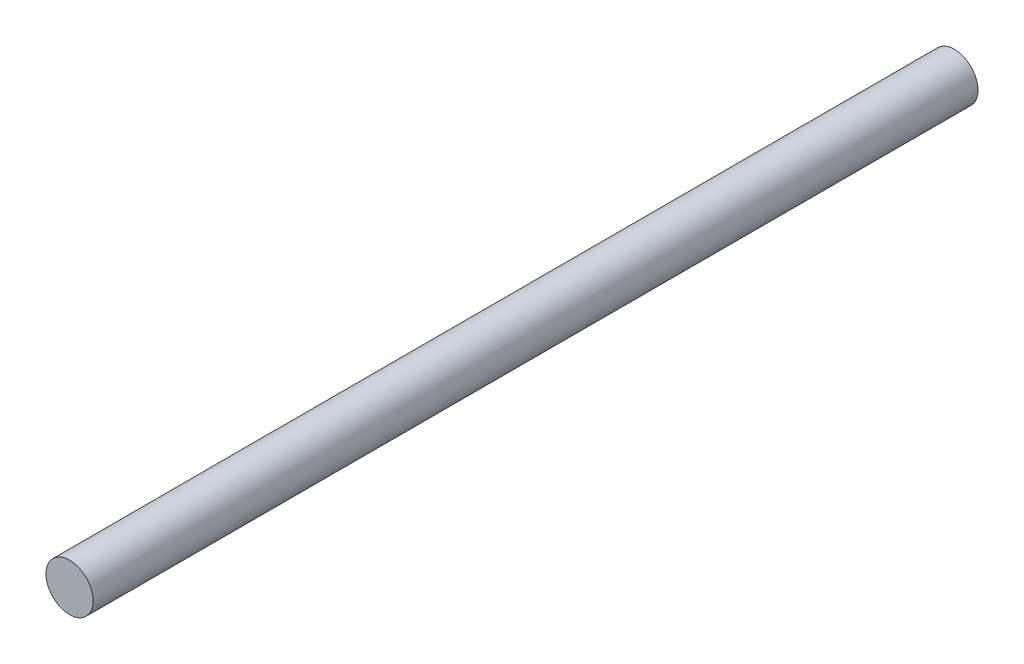
ISO-10303-21;
HEADER;
FILE_DESCRIPTION(('STEP AP214'),'2;1');
FILE_NAME('part.step','',(''),(''),'','','');
FILE_SCHEMA(('AUTOMOTIVE_DESIGN { 1 0 10303 214 1 1 1 1 }'));
ENDSEC;
DATA;
#1=APPLICATION_CONTEXT('core data for automotive mechanical design processes');
#2=APPLICATION_PROTOCOL_DEFINITION('international standard','automotive_design',2000,#1);
#3=PRODUCT_CONTEXT('',#1,'mechanical');
#4=PRODUCT('Part','Part','',(#3));
#5=PRODUCT_RELATED_PRODUCT_CATEGORY('part','',(#4));
#6=PRODUCT_DEFINITION_FORMATION('','',#4);
#7=PRODUCT_DEFINITION_CONTEXT('part definition',#1,'design');
#8=PRODUCT_DEFINITION('design','',#6,#7);
#9=PRODUCT_DEFINITION_SHAPE('','',#8);
#10=(LENGTH_UNIT() NAMED_UNIT(*) SI_UNIT(.MILLI.,.METRE.));
#11=(NAMED_UNIT(*) PLANE_ANGLE_UNIT() SI_UNIT($,.RADIAN.));
#12=(NAMED_UNIT(*) SI_UNIT($,.STERADIAN.) SOLID_ANGLE_UNIT());
#13=UNCERTAINTY_MEASURE_WITH_UNIT(LENGTH_MEASURE(1.E-05),#10,'distance_accuracy_value','');
#14=(GEOMETRIC_REPRESENTATION_CONTEXT(3) GLOBAL_UNCERTAINTY_ASSIGNED_CONTEXT((#13)) GLOBAL_UNIT_ASSIGNED_CONTEXT((#10,
#11,#12)) REPRESENTATION_CONTEXT('',''));
#15=CARTESIAN_POINT('',(0.,0.,0.));
#16=DIRECTION('',(0.,0.,1.));
#17=DIRECTION('',(1.,0.,0.));
#18=AXIS2_PLACEMENT_3D('',#15,#16,#17);
#19=CARTESIAN_POINT('',(0.,0.,300.));
#20=DIRECTION('',(0.,0.,-1.));
#21=DIRECTION('',(-1.,0.,0.));
#22=AXIS2_PLACEMENT_3D('',#19,#20,#21);
#23=CYLINDRICAL_SURFACE('',#22,8.);
#24=CARTESIAN_POINT('',(0.,0.,300.));
#25=DIRECTION('',(0.,0.,1.));
#26=DIRECTION('',(1.,0.,0.));
#27=AXIS2_PLACEMENT_3D('',#24,#25,#26);
#28=CIRCLE('',#27,8.);
#29=CARTESIAN_POINT('',(8.,0.,300.));
#30=VERTEX_POINT('',#29);
#31=EDGE_CURVE('E10',#30,#30,#28,.T.);
#32=ORIENTED_EDGE('',*,*,#31,.F.);
#33=EDGE_LOOP('',(#32));
#34=FACE_BOUND('',#33,.T.);
#35=CARTESIAN_POINT('',(0.,0.,0.));
#36=DIRECTION('',(0.,0.,1.));
#37=DIRECTION('',(1.,0.,0.));
#38=AXIS2_PLACEMENT_3D('',#35,#36,#37);
#39=CIRCLE('',#38,8.);
#40=CARTESIAN_POINT('',(8.,0.,0.));
#41=VERTEX_POINT('',#40);
#42=EDGE_CURVE('E40',#41,#41,#39,.T.);
#43=ORIENTED_EDGE('',*,*,#42,.T.);
#44=EDGE_LOOP('',(#43));
#45=FACE_BOUND('',#44,.T.);
#46=ADVANCED_FACE('F37',(#34,#45),#23,.T.);
#47=CARTESIAN_POINT('',(0.,0.,300.));
#48=DIRECTION('',(0.,0.,1.));
#49=DIRECTION('',(1.,0.,0.));
#50=AXIS2_PLACEMENT_3D('',#47,#48,#49);
#51=PLANE('',#50);
#52=ORIENTED_EDGE('',*,*,#31,.T.);
#53=EDGE_LOOP('',(#52));
#54=FACE_BOUND('',#53,.T.);
#55=ADVANCED_FACE('F54',(#54),#51,.T.);
#56=CARTESIAN_POINT('',(0.,0.,0.));
#57=DIRECTION('',(0.,0.,1.));
#58=DIRECTION('',(1.,0.,0.));
#59=AXIS2_PLACEMENT_3D('',#56,#57,#58);
#60=PLANE('',#59);
#61=ORIENTED_EDGE('',*,*,#42,.F.);
#62=EDGE_LOOP('',(#61));
#63=FACE_BOUND('',#62,.T.);
#64=ADVANCED_FACE('F52',(#63),#60,.F.);
#65=CLOSED_SHELL('',(#46,#55,#64));
#66=MANIFOLD_SOLID_BREP('B2',#65);
#67=ADVANCED_BREP_SHAPE_REPRESENTATION('',(#18,#66),#14);
#68=SHAPE_DEFINITION_REPRESENTATION(#9,#67);
ENDSEC;
END-ISO-10303-21;
